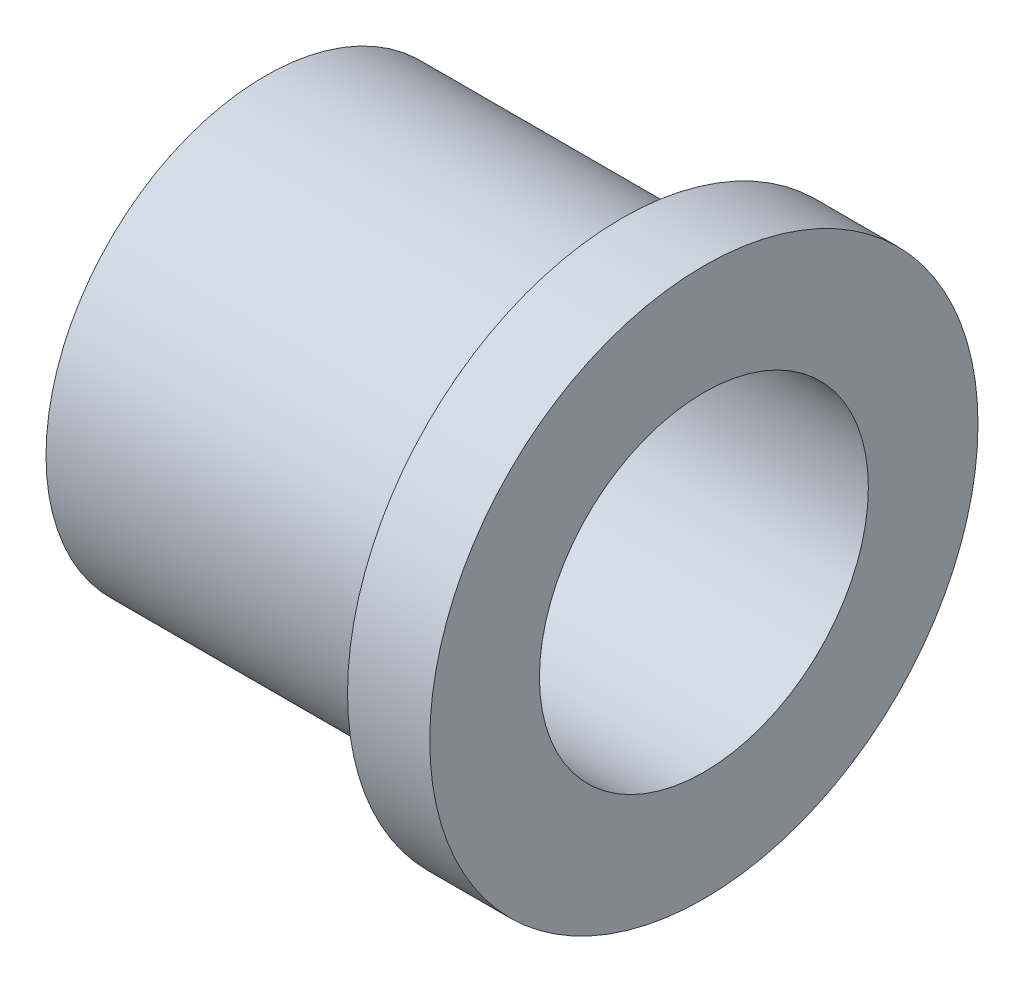
ISO-10303-21;
HEADER;
FILE_DESCRIPTION(('STEP AP214'),'2;1');
FILE_NAME('part.step','',(''),(''),'','','');
FILE_SCHEMA(('AUTOMOTIVE_DESIGN { 1 0 10303 214 1 1 1 1 }'));
ENDSEC;
DATA;
#1=APPLICATION_CONTEXT('core data for automotive mechanical design processes');
#2=APPLICATION_PROTOCOL_DEFINITION('international standard','automotive_design',2000,#1);
#3=PRODUCT_CONTEXT('',#1,'mechanical');
#4=PRODUCT('Part','Part','',(#3));
#5=PRODUCT_RELATED_PRODUCT_CATEGORY('part','',(#4));
#6=PRODUCT_DEFINITION_FORMATION('','',#4);
#7=PRODUCT_DEFINITION_CONTEXT('part definition',#1,'design');
#8=PRODUCT_DEFINITION('design','',#6,#7);
#9=PRODUCT_DEFINITION_SHAPE('','',#8);
#10=(LENGTH_UNIT() NAMED_UNIT(*) SI_UNIT(.MILLI.,.METRE.));
#11=(NAMED_UNIT(*) PLANE_ANGLE_UNIT() SI_UNIT($,.RADIAN.));
#12=(NAMED_UNIT(*) SI_UNIT($,.STERADIAN.) SOLID_ANGLE_UNIT());
#13=UNCERTAINTY_MEASURE_WITH_UNIT(LENGTH_MEASURE(1.E-05),#10,'distance_accuracy_value','');
#14=(GEOMETRIC_REPRESENTATION_CONTEXT(3) GLOBAL_UNCERTAINTY_ASSIGNED_CONTEXT((#13)) GLOBAL_UNIT_ASSIGNED_CONTEXT((#10,
#11,#12)) REPRESENTATION_CONTEXT('',''));
#15=CARTESIAN_POINT('',(0.,0.,0.));
#16=DIRECTION('',(0.,0.,1.));
#17=DIRECTION('',(1.,0.,0.));
#18=AXIS2_PLACEMENT_3D('',#15,#16,#17);
#19=CARTESIAN_POINT('',(-25.4,9.525,0.));
#20=DIRECTION('',(1.,0.,0.));
#21=DIRECTION('',(0.,0.,-1.));
#22=AXIS2_PLACEMENT_3D('',#19,#20,#21);
#23=PLANE('',#22);
#24=CARTESIAN_POINT('',(-25.4,0.,0.));
#25=DIRECTION('',(-1.,0.,0.));
#26=DIRECTION('',(0.,0.,1.));
#27=AXIS2_PLACEMENT_3D('',#24,#25,#26);
#28=CIRCLE('',#27,9.525);
#29=CARTESIAN_POINT('',(-25.4,0.,9.525));
#30=VERTEX_POINT('',#29);
#31=EDGE_CURVE('E52',#30,#30,#28,.T.);
#32=ORIENTED_EDGE('',*,*,#31,.F.);
#33=EDGE_LOOP('',(#32));
#34=FACE_BOUND('',#33,.T.);
#35=CARTESIAN_POINT('',(-25.4,0.,0.));
#36=DIRECTION('',(-1.,0.,0.));
#37=DIRECTION('',(0.,0.,1.));
#38=AXIS2_PLACEMENT_3D('',#35,#36,#37);
#39=CIRCLE('',#38,12.7);
#40=CARTESIAN_POINT('',(-25.4,0.,12.7));
#41=VERTEX_POINT('',#40);
#42=EDGE_CURVE('E10',#41,#41,#39,.T.);
#43=ORIENTED_EDGE('',*,*,#42,.T.);
#44=EDGE_LOOP('',(#43));
#45=FACE_BOUND('',#44,.T.);
#46=ADVANCED_FACE('F30',(#34,#45),#23,.F.);
#47=CARTESIAN_POINT('',(0.,0.,0.));
#48=DIRECTION('',(-1.,0.,0.));
#49=DIRECTION('',(0.,0.,1.));
#50=AXIS2_PLACEMENT_3D('',#47,#48,#49);
#51=CYLINDRICAL_SURFACE('',#50,12.7);
#52=ORIENTED_EDGE('',*,*,#42,.F.);
#53=EDGE_LOOP('',(#52));
#54=FACE_BOUND('',#53,.T.);
#55=CARTESIAN_POINT('',(-4.7625,0.,0.));
#56=DIRECTION('',(-1.,0.,0.));
#57=DIRECTION('',(0.,0.,1.));
#58=AXIS2_PLACEMENT_3D('',#55,#56,#57);
#59=CIRCLE('',#58,12.7);
#60=CARTESIAN_POINT('',(-4.7625,0.,12.7));
#61=VERTEX_POINT('',#60);
#62=EDGE_CURVE('E36',#61,#61,#59,.T.);
#63=ORIENTED_EDGE('',*,*,#62,.T.);
#64=EDGE_LOOP('',(#63));
#65=FACE_BOUND('',#64,.T.);
#66=ADVANCED_FACE('F59',(#54,#65),#51,.T.);
#67=CARTESIAN_POINT('',(-4.7625,12.7,0.));
#68=DIRECTION('',(1.,0.,0.));
#69=DIRECTION('',(0.,0.,-1.));
#70=AXIS2_PLACEMENT_3D('',#67,#68,#69);
#71=PLANE('',#70);
#72=ORIENTED_EDGE('',*,*,#62,.F.);
#73=EDGE_LOOP('',(#72));
#74=FACE_BOUND('',#73,.T.);
#75=CARTESIAN_POINT('',(-4.7625,0.,0.));
#76=DIRECTION('',(-1.,0.,0.));
#77=DIRECTION('',(0.,0.,1.));
#78=AXIS2_PLACEMENT_3D('',#75,#76,#77);
#79=CIRCLE('',#78,15.875);
#80=CARTESIAN_POINT('',(-4.7625,0.,15.875));
#81=VERTEX_POINT('',#80);
#82=EDGE_CURVE('E40',#81,#81,#79,.T.);
#83=ORIENTED_EDGE('',*,*,#82,.T.);
#84=EDGE_LOOP('',(#83));
#85=FACE_BOUND('',#84,.T.);
#86=ADVANCED_FACE('F63',(#74,#85),#71,.F.);
#87=CARTESIAN_POINT('',(0.,0.,0.));
#88=DIRECTION('',(-1.,0.,0.));
#89=DIRECTION('',(0.,0.,1.));
#90=AXIS2_PLACEMENT_3D('',#87,#88,#89);
#91=CYLINDRICAL_SURFACE('',#90,15.875);
#92=ORIENTED_EDGE('',*,*,#82,.F.);
#93=EDGE_LOOP('',(#92));
#94=FACE_BOUND('',#93,.T.);
#95=CARTESIAN_POINT('',(0.,0.,0.));
#96=DIRECTION('',(-1.,0.,0.));
#97=DIRECTION('',(0.,0.,1.));
#98=AXIS2_PLACEMENT_3D('',#95,#96,#97);
#99=CIRCLE('',#98,15.875);
#100=CARTESIAN_POINT('',(0.,0.,15.875));
#101=VERTEX_POINT('',#100);
#102=EDGE_CURVE('E44',#101,#101,#99,.T.);
#103=ORIENTED_EDGE('',*,*,#102,.T.);
#104=EDGE_LOOP('',(#103));
#105=FACE_BOUND('',#104,.T.);
#106=ADVANCED_FACE('F68',(#94,#105),#91,.T.);
#107=CARTESIAN_POINT('',(0.,15.875,0.));
#108=DIRECTION('',(-1.,0.,0.));
#109=DIRECTION('',(0.,0.,1.));
#110=AXIS2_PLACEMENT_3D('',#107,#108,#109);
#111=PLANE('',#110);
#112=ORIENTED_EDGE('',*,*,#102,.F.);
#113=EDGE_LOOP('',(#112));
#114=FACE_BOUND('',#113,.T.);
#115=CARTESIAN_POINT('',(0.,0.,0.));
#116=DIRECTION('',(-1.,0.,0.));
#117=DIRECTION('',(0.,0.,1.));
#118=AXIS2_PLACEMENT_3D('',#115,#116,#117);
#119=CIRCLE('',#118,9.525);
#120=CARTESIAN_POINT('',(0.,0.,9.525));
#121=VERTEX_POINT('',#120);
#122=EDGE_CURVE('E49',#121,#121,#119,.T.);
#123=ORIENTED_EDGE('',*,*,#122,.T.);
#124=EDGE_LOOP('',(#123));
#125=FACE_BOUND('',#124,.T.);
#126=ADVANCED_FACE('F74',(#114,#125),#111,.F.);
#127=CARTESIAN_POINT('',(0.,0.,0.));
#128=DIRECTION('',(-1.,0.,0.));
#129=DIRECTION('',(0.,0.,1.));
#130=AXIS2_PLACEMENT_3D('',#127,#128,#129);
#131=CYLINDRICAL_SURFACE('',#130,9.525);
#132=ORIENTED_EDGE('',*,*,#122,.F.);
#133=EDGE_LOOP('',(#132));
#134=FACE_BOUND('',#133,.T.);
#135=ORIENTED_EDGE('',*,*,#31,.T.);
#136=EDGE_LOOP('',(#135));
#137=FACE_BOUND('',#136,.T.);
#138=ADVANCED_FACE('F56',(#134,#137),#131,.F.);
#139=CLOSED_SHELL('',(#46,#66,#86,#106,#126,#138));
#140=MANIFOLD_SOLID_BREP('B2',#139);
#141=ADVANCED_BREP_SHAPE_REPRESENTATION('',(#18,#140),#14);
#142=SHAPE_DEFINITION_REPRESENTATION(#9,#141);
ENDSEC;
END-ISO-10303-21;
